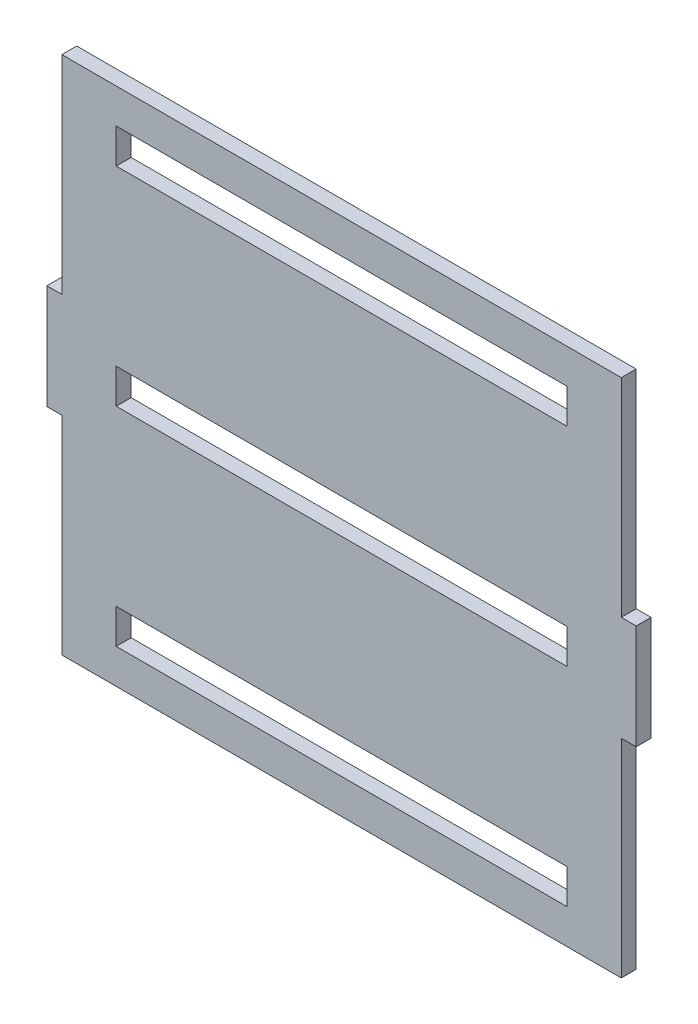
ISO-10303-21;
HEADER;
FILE_DESCRIPTION(('STEP AP214'),'2;1');
FILE_NAME('part.step','',(''),(''),'','','');
FILE_SCHEMA(('AUTOMOTIVE_DESIGN { 1 0 10303 214 1 1 1 1 }'));
ENDSEC;
DATA;
#1=APPLICATION_CONTEXT('core data for automotive mechanical design processes');
#2=APPLICATION_PROTOCOL_DEFINITION('international standard','automotive_design',2000,#1);
#3=PRODUCT_CONTEXT('',#1,'mechanical');
#4=PRODUCT('Part','Part','',(#3));
#5=PRODUCT_RELATED_PRODUCT_CATEGORY('part','',(#4));
#6=PRODUCT_DEFINITION_FORMATION('','',#4);
#7=PRODUCT_DEFINITION_CONTEXT('part definition',#1,'design');
#8=PRODUCT_DEFINITION('design','',#6,#7);
#9=PRODUCT_DEFINITION_SHAPE('','',#8);
#10=(LENGTH_UNIT() NAMED_UNIT(*) SI_UNIT(.MILLI.,.METRE.));
#11=(NAMED_UNIT(*) PLANE_ANGLE_UNIT() SI_UNIT($,.RADIAN.));
#12=(NAMED_UNIT(*) SI_UNIT($,.STERADIAN.) SOLID_ANGLE_UNIT());
#13=UNCERTAINTY_MEASURE_WITH_UNIT(LENGTH_MEASURE(1.E-05),#10,'distance_accuracy_value','');
#14=(GEOMETRIC_REPRESENTATION_CONTEXT(3) GLOBAL_UNCERTAINTY_ASSIGNED_CONTEXT((#13)) GLOBAL_UNIT_ASSIGNED_CONTEXT((#10,
#11,#12)) REPRESENTATION_CONTEXT('',''));
#15=CARTESIAN_POINT('',(0.,0.,0.));
#16=DIRECTION('',(0.,0.,1.));
#17=DIRECTION('',(1.,0.,0.));
#18=AXIS2_PLACEMENT_3D('',#15,#16,#17);
#19=CARTESIAN_POINT('',(0.,0.,4.3));
#20=DIRECTION('',(0.,0.,1.));
#21=DIRECTION('',(1.,0.,0.));
#22=AXIS2_PLACEMENT_3D('',#19,#20,#21);
#23=PLANE('',#22);
#24=DIRECTION('',(-1.,0.,0.));
#25=VECTOR('',#24,1.);
#26=CARTESIAN_POINT('',(-80.7,75.,4.3));
#27=LINE('',#26,#25);
#28=CARTESIAN_POINT('',(80.7,75.,4.3));
#29=VERTEX_POINT('',#28);
#30=CARTESIAN_POINT('',(-80.7,75.,4.3));
#31=VERTEX_POINT('',#30);
#32=EDGE_CURVE('E295',#29,#31,#27,.T.);
#33=ORIENTED_EDGE('',*,*,#32,.T.);
#34=DIRECTION('',(0.,-1.,0.));
#35=VECTOR('',#34,1.);
#36=CARTESIAN_POINT('',(-80.7,15.1,4.3));
#37=LINE('',#36,#35);
#38=CARTESIAN_POINT('',(-80.7,15.1,4.3));
#39=VERTEX_POINT('',#38);
#40=EDGE_CURVE('E298',#31,#39,#37,.T.);
#41=ORIENTED_EDGE('',*,*,#40,.T.);
#42=DIRECTION('',(-1.,0.,0.));
#43=VECTOR('',#42,1.);
#44=CARTESIAN_POINT('',(-80.7,15.1,4.3));
#45=LINE('',#44,#43);
#46=CARTESIAN_POINT('',(-85.,15.1,4.3));
#47=VERTEX_POINT('',#46);
#48=EDGE_CURVE('E301',#39,#47,#45,.T.);
#49=ORIENTED_EDGE('',*,*,#48,.T.);
#50=DIRECTION('',(0.,-1.,0.));
#51=VECTOR('',#50,1.);
#52=CARTESIAN_POINT('',(-85.,15.1,4.3));
#53=LINE('',#52,#51);
#54=CARTESIAN_POINT('',(-85.,-15.1,4.3));
#55=VERTEX_POINT('',#54);
#56=EDGE_CURVE('E303',#47,#55,#53,.T.);
#57=ORIENTED_EDGE('',*,*,#56,.T.);
#58=DIRECTION('',(1.,0.,0.));
#59=VECTOR('',#58,1.);
#60=CARTESIAN_POINT('',(-80.7,-15.1,4.3));
#61=LINE('',#60,#59);
#62=CARTESIAN_POINT('',(-80.7,-15.1,4.3));
#63=VERTEX_POINT('',#62);
#64=EDGE_CURVE('E305',#55,#63,#61,.T.);
#65=ORIENTED_EDGE('',*,*,#64,.T.);
#66=DIRECTION('',(0.,-1.,0.));
#67=VECTOR('',#66,1.);
#68=CARTESIAN_POINT('',(-80.7,-75.,4.3));
#69=LINE('',#68,#67);
#70=CARTESIAN_POINT('',(-80.7,-75.,4.3));
#71=VERTEX_POINT('',#70);
#72=EDGE_CURVE('E307',#63,#71,#69,.T.);
#73=ORIENTED_EDGE('',*,*,#72,.T.);
#74=DIRECTION('',(1.,0.,0.));
#75=VECTOR('',#74,1.);
#76=CARTESIAN_POINT('',(-80.7,-75.,4.3));
#77=LINE('',#76,#75);
#78=CARTESIAN_POINT('',(80.7,-75.,4.3));
#79=VERTEX_POINT('',#78);
#80=EDGE_CURVE('E309',#71,#79,#77,.T.);
#81=ORIENTED_EDGE('',*,*,#80,.T.);
#82=DIRECTION('',(0.,1.,0.));
#83=VECTOR('',#82,1.);
#84=CARTESIAN_POINT('',(80.7,-75.,4.3));
#85=LINE('',#84,#83);
#86=CARTESIAN_POINT('',(80.7,-15.1,4.3));
#87=VERTEX_POINT('',#86);
#88=EDGE_CURVE('E311',#79,#87,#85,.T.);
#89=ORIENTED_EDGE('',*,*,#88,.T.);
#90=DIRECTION('',(1.,0.,0.));
#91=VECTOR('',#90,1.);
#92=CARTESIAN_POINT('',(80.7,-15.1,4.3));
#93=LINE('',#92,#91);
#94=CARTESIAN_POINT('',(85.,-15.1,4.3));
#95=VERTEX_POINT('',#94);
#96=EDGE_CURVE('E313',#87,#95,#93,.T.);
#97=ORIENTED_EDGE('',*,*,#96,.T.);
#98=DIRECTION('',(0.,1.,0.));
#99=VECTOR('',#98,1.);
#100=CARTESIAN_POINT('',(85.,15.1,4.3));
#101=LINE('',#100,#99);
#102=CARTESIAN_POINT('',(85.,15.1,4.3));
#103=VERTEX_POINT('',#102);
#104=EDGE_CURVE('E315',#95,#103,#101,.T.);
#105=ORIENTED_EDGE('',*,*,#104,.T.);
#106=DIRECTION('',(-1.,0.,0.));
#107=VECTOR('',#106,1.);
#108=CARTESIAN_POINT('',(80.7,15.1,4.3));
#109=LINE('',#108,#107);
#110=CARTESIAN_POINT('',(80.7,15.1,4.3));
#111=VERTEX_POINT('',#110);
#112=EDGE_CURVE('E317',#103,#111,#109,.T.);
#113=ORIENTED_EDGE('',*,*,#112,.T.);
#114=DIRECTION('',(0.,1.,0.));
#115=VECTOR('',#114,1.);
#116=CARTESIAN_POINT('',(80.7,15.1,4.3));
#117=LINE('',#116,#115);
#118=EDGE_CURVE('E319',#111,#29,#117,.T.);
#119=ORIENTED_EDGE('',*,*,#118,.T.);
#120=EDGE_LOOP('',(#33,#41,#49,#57,#65,#73,#81,#89,#97,#105,#113,#119));
#121=FACE_BOUND('',#120,.T.);
#122=DIRECTION('',(1.,0.,0.));
#123=VECTOR('',#122,1.);
#124=CARTESIAN_POINT('',(-65.,55.,4.3));
#125=LINE('',#124,#123);
#126=CARTESIAN_POINT('',(-65.,55.,4.3));
#127=VERTEX_POINT('',#126);
#128=CARTESIAN_POINT('',(65.,55.,4.3));
#129=VERTEX_POINT('',#128);
#130=EDGE_CURVE('E266',#127,#129,#125,.T.);
#131=ORIENTED_EDGE('',*,*,#130,.F.);
#132=DIRECTION('',(0.,-1.,0.));
#133=VECTOR('',#132,1.);
#134=CARTESIAN_POINT('',(-65.,65.,4.3));
#135=LINE('',#134,#133);
#136=CARTESIAN_POINT('',(-65.,65.,4.3));
#137=VERTEX_POINT('',#136);
#138=EDGE_CURVE('E264',#137,#127,#135,.T.);
#139=ORIENTED_EDGE('',*,*,#138,.F.);
#140=DIRECTION('',(-1.,0.,0.));
#141=VECTOR('',#140,1.);
#142=CARTESIAN_POINT('',(-65.,65.,4.3));
#143=LINE('',#142,#141);
#144=CARTESIAN_POINT('',(65.,65.,4.3));
#145=VERTEX_POINT('',#144);
#146=EDGE_CURVE('E272',#145,#137,#143,.T.);
#147=ORIENTED_EDGE('',*,*,#146,.F.);
#148=DIRECTION('',(0.,1.,0.));
#149=VECTOR('',#148,1.);
#150=CARTESIAN_POINT('',(65.,65.,4.3));
#151=LINE('',#150,#149);
#152=EDGE_CURVE('E269',#129,#145,#151,.T.);
#153=ORIENTED_EDGE('',*,*,#152,.F.);
#154=EDGE_LOOP('',(#131,#139,#147,#153));
#155=FACE_BOUND('',#154,.T.);
#156=DIRECTION('',(1.,0.,0.));
#157=VECTOR('',#156,1.);
#158=CARTESIAN_POINT('',(-65.,-5.,4.3));
#159=LINE('',#158,#157);
#160=CARTESIAN_POINT('',(-65.,-5.,4.3));
#161=VERTEX_POINT('',#160);
#162=CARTESIAN_POINT('',(65.,-4.99999999999999,4.3));
#163=VERTEX_POINT('',#162);
#164=EDGE_CURVE('E235',#161,#163,#159,.T.);
#165=ORIENTED_EDGE('',*,*,#164,.F.);
#166=DIRECTION('',(0.,-1.,0.));
#167=VECTOR('',#166,1.);
#168=CARTESIAN_POINT('',(-65.,-5.,4.3));
#169=LINE('',#168,#167);
#170=CARTESIAN_POINT('',(-65.,5.,4.3));
#171=VERTEX_POINT('',#170);
#172=EDGE_CURVE('E233',#171,#161,#169,.T.);
#173=ORIENTED_EDGE('',*,*,#172,.F.);
#174=DIRECTION('',(-1.,0.,0.));
#175=VECTOR('',#174,1.);
#176=CARTESIAN_POINT('',(-65.,5.,4.3));
#177=LINE('',#176,#175);
#178=CARTESIAN_POINT('',(65.,5.00000000000001,4.3));
#179=VERTEX_POINT('',#178);
#180=EDGE_CURVE('E241',#179,#171,#177,.T.);
#181=ORIENTED_EDGE('',*,*,#180,.F.);
#182=DIRECTION('',(0.,1.,0.));
#183=VECTOR('',#182,1.);
#184=CARTESIAN_POINT('',(65.,-4.99999999999999,4.3));
#185=LINE('',#184,#183);
#186=EDGE_CURVE('E238',#163,#179,#185,.T.);
#187=ORIENTED_EDGE('',*,*,#186,.F.);
#188=EDGE_LOOP('',(#165,#173,#181,#187));
#189=FACE_BOUND('',#188,.T.);
#190=DIRECTION('',(1.,0.,0.));
#191=VECTOR('',#190,1.);
#192=CARTESIAN_POINT('',(-65.,-65.,4.3));
#193=LINE('',#192,#191);
#194=CARTESIAN_POINT('',(-65.,-65.,4.3));
#195=VERTEX_POINT('',#194);
#196=CARTESIAN_POINT('',(65.,-65.,4.3));
#197=VERTEX_POINT('',#196);
#198=EDGE_CURVE('E205',#195,#197,#193,.T.);
#199=ORIENTED_EDGE('',*,*,#198,.F.);
#200=DIRECTION('',(0.,-1.,0.));
#201=VECTOR('',#200,1.);
#202=CARTESIAN_POINT('',(-65.,-65.,4.3));
#203=LINE('',#202,#201);
#204=CARTESIAN_POINT('',(-65.,-55.,4.3));
#205=VERTEX_POINT('',#204);
#206=EDGE_CURVE('E197',#205,#195,#203,.T.);
#207=ORIENTED_EDGE('',*,*,#206,.F.);
#208=DIRECTION('',(-1.,0.,0.));
#209=VECTOR('',#208,1.);
#210=CARTESIAN_POINT('',(-65.,-55.,4.3));
#211=LINE('',#210,#209);
#212=CARTESIAN_POINT('',(65.,-55.,4.3));
#213=VERTEX_POINT('',#212);
#214=EDGE_CURVE('E219',#213,#205,#211,.T.);
#215=ORIENTED_EDGE('',*,*,#214,.F.);
#216=DIRECTION('',(0.,1.,0.));
#217=VECTOR('',#216,1.);
#218=CARTESIAN_POINT('',(65.,-65.,4.3));
#219=LINE('',#218,#217);
#220=EDGE_CURVE('E217',#197,#213,#219,.T.);
#221=ORIENTED_EDGE('',*,*,#220,.F.);
#222=EDGE_LOOP('',(#199,#207,#215,#221));
#223=FACE_BOUND('',#222,.T.);
#224=ADVANCED_FACE('F36',(#121,#155,#189,#223),#23,.T.);
#225=CARTESIAN_POINT('',(0.,0.,0.));
#226=DIRECTION('',(0.,0.,1.));
#227=DIRECTION('',(1.,0.,0.));
#228=AXIS2_PLACEMENT_3D('',#225,#226,#227);
#229=PLANE('',#228);
#230=DIRECTION('',(0.,-1.,0.));
#231=VECTOR('',#230,1.);
#232=CARTESIAN_POINT('',(-65.,-5.,0.));
#233=LINE('',#232,#231);
#234=CARTESIAN_POINT('',(-65.,5.,0.));
#235=VERTEX_POINT('',#234);
#236=CARTESIAN_POINT('',(-65.,-5.,0.));
#237=VERTEX_POINT('',#236);
#238=EDGE_CURVE('E213',#235,#237,#233,.T.);
#239=ORIENTED_EDGE('',*,*,#238,.T.);
#240=DIRECTION('',(1.,0.,0.));
#241=VECTOR('',#240,1.);
#242=CARTESIAN_POINT('',(-65.,-5.,0.));
#243=LINE('',#242,#241);
#244=CARTESIAN_POINT('',(65.,-4.99999999999999,0.));
#245=VERTEX_POINT('',#244);
#246=EDGE_CURVE('E246',#237,#245,#243,.T.);
#247=ORIENTED_EDGE('',*,*,#246,.T.);
#248=DIRECTION('',(0.,1.,0.));
#249=VECTOR('',#248,1.);
#250=CARTESIAN_POINT('',(65.,-4.99999999999999,0.));
#251=LINE('',#250,#249);
#252=CARTESIAN_POINT('',(65.,5.00000000000001,0.));
#253=VERTEX_POINT('',#252);
#254=EDGE_CURVE('E249',#245,#253,#251,.T.);
#255=ORIENTED_EDGE('',*,*,#254,.T.);
#256=DIRECTION('',(-1.,0.,0.));
#257=VECTOR('',#256,1.);
#258=CARTESIAN_POINT('',(-65.,5.,0.));
#259=LINE('',#258,#257);
#260=EDGE_CURVE('E236',#253,#235,#259,.T.);
#261=ORIENTED_EDGE('',*,*,#260,.T.);
#262=EDGE_LOOP('',(#239,#247,#255,#261));
#263=FACE_BOUND('',#262,.T.);
#264=DIRECTION('',(-1.,0.,0.));
#265=VECTOR('',#264,1.);
#266=CARTESIAN_POINT('',(-80.7,75.,0.));
#267=LINE('',#266,#265);
#268=CARTESIAN_POINT('',(80.7,75.,0.));
#269=VERTEX_POINT('',#268);
#270=CARTESIAN_POINT('',(-80.7,75.,0.));
#271=VERTEX_POINT('',#270);
#272=EDGE_CURVE('E294',#269,#271,#267,.T.);
#273=ORIENTED_EDGE('',*,*,#272,.F.);
#274=DIRECTION('',(0.,1.,0.));
#275=VECTOR('',#274,1.);
#276=CARTESIAN_POINT('',(80.7,15.1,0.));
#277=LINE('',#276,#275);
#278=CARTESIAN_POINT('',(80.7,15.1,0.));
#279=VERTEX_POINT('',#278);
#280=EDGE_CURVE('E299',#279,#269,#277,.T.);
#281=ORIENTED_EDGE('',*,*,#280,.F.);
#282=DIRECTION('',(-1.,0.,0.));
#283=VECTOR('',#282,1.);
#284=CARTESIAN_POINT('',(80.7,15.1,0.));
#285=LINE('',#284,#283);
#286=CARTESIAN_POINT('',(85.,15.1,0.));
#287=VERTEX_POINT('',#286);
#288=EDGE_CURVE('E342',#287,#279,#285,.T.);
#289=ORIENTED_EDGE('',*,*,#288,.F.);
#290=DIRECTION('',(0.,1.,0.));
#291=VECTOR('',#290,1.);
#292=CARTESIAN_POINT('',(85.,15.1,0.));
#293=LINE('',#292,#291);
#294=CARTESIAN_POINT('',(85.,-15.1,0.));
#295=VERTEX_POINT('',#294);
#296=EDGE_CURVE('E340',#295,#287,#293,.T.);
#297=ORIENTED_EDGE('',*,*,#296,.F.);
#298=DIRECTION('',(1.,0.,0.));
#299=VECTOR('',#298,1.);
#300=CARTESIAN_POINT('',(80.7,-15.1,0.));
#301=LINE('',#300,#299);
#302=CARTESIAN_POINT('',(80.7,-15.1,0.));
#303=VERTEX_POINT('',#302);
#304=EDGE_CURVE('E338',#303,#295,#301,.T.);
#305=ORIENTED_EDGE('',*,*,#304,.F.);
#306=DIRECTION('',(0.,1.,0.));
#307=VECTOR('',#306,1.);
#308=CARTESIAN_POINT('',(80.7,-75.,0.));
#309=LINE('',#308,#307);
#310=CARTESIAN_POINT('',(80.7,-75.,0.));
#311=VERTEX_POINT('',#310);
#312=EDGE_CURVE('E336',#311,#303,#309,.T.);
#313=ORIENTED_EDGE('',*,*,#312,.F.);
#314=DIRECTION('',(1.,0.,0.));
#315=VECTOR('',#314,1.);
#316=CARTESIAN_POINT('',(-80.7,-75.,0.));
#317=LINE('',#316,#315);
#318=CARTESIAN_POINT('',(-80.7,-75.,0.));
#319=VERTEX_POINT('',#318);
#320=EDGE_CURVE('E334',#319,#311,#317,.T.);
#321=ORIENTED_EDGE('',*,*,#320,.F.);
#322=DIRECTION('',(0.,-1.,0.));
#323=VECTOR('',#322,1.);
#324=CARTESIAN_POINT('',(-80.7,-75.,0.));
#325=LINE('',#324,#323);
#326=CARTESIAN_POINT('',(-80.7,-15.1,0.));
#327=VERTEX_POINT('',#326);
#328=EDGE_CURVE('E332',#327,#319,#325,.T.);
#329=ORIENTED_EDGE('',*,*,#328,.F.);
#330=DIRECTION('',(1.,0.,0.));
#331=VECTOR('',#330,1.);
#332=CARTESIAN_POINT('',(-80.7,-15.1,0.));
#333=LINE('',#332,#331);
#334=CARTESIAN_POINT('',(-85.,-15.1,0.));
#335=VERTEX_POINT('',#334);
#336=EDGE_CURVE('E330',#335,#327,#333,.T.);
#337=ORIENTED_EDGE('',*,*,#336,.F.);
#338=DIRECTION('',(0.,-1.,0.));
#339=VECTOR('',#338,1.);
#340=CARTESIAN_POINT('',(-85.,15.1,0.));
#341=LINE('',#340,#339);
#342=CARTESIAN_POINT('',(-85.,15.1,0.));
#343=VERTEX_POINT('',#342);
#344=EDGE_CURVE('E328',#343,#335,#341,.T.);
#345=ORIENTED_EDGE('',*,*,#344,.F.);
#346=DIRECTION('',(-1.,0.,0.));
#347=VECTOR('',#346,1.);
#348=CARTESIAN_POINT('',(-80.7,15.1,0.));
#349=LINE('',#348,#347);
#350=CARTESIAN_POINT('',(-80.7,15.1,0.));
#351=VERTEX_POINT('',#350);
#352=EDGE_CURVE('E326',#351,#343,#349,.T.);
#353=ORIENTED_EDGE('',*,*,#352,.F.);
#354=DIRECTION('',(0.,-1.,0.));
#355=VECTOR('',#354,1.);
#356=CARTESIAN_POINT('',(-80.7,15.1,0.));
#357=LINE('',#356,#355);
#358=EDGE_CURVE('E324',#271,#351,#357,.T.);
#359=ORIENTED_EDGE('',*,*,#358,.F.);
#360=EDGE_LOOP('',(#273,#281,#289,#297,#305,#313,#321,#329,#337,#345,#353,#359));
#361=FACE_BOUND('',#360,.T.);
#362=DIRECTION('',(0.,-1.,0.));
#363=VECTOR('',#362,1.);
#364=CARTESIAN_POINT('',(-65.,65.,0.));
#365=LINE('',#364,#363);
#366=CARTESIAN_POINT('',(-65.,65.,0.));
#367=VERTEX_POINT('',#366);
#368=CARTESIAN_POINT('',(-65.,55.,0.));
#369=VERTEX_POINT('',#368);
#370=EDGE_CURVE('E263',#367,#369,#365,.T.);
#371=ORIENTED_EDGE('',*,*,#370,.T.);
#372=DIRECTION('',(1.,0.,0.));
#373=VECTOR('',#372,1.);
#374=CARTESIAN_POINT('',(-65.,55.,0.));
#375=LINE('',#374,#373);
#376=CARTESIAN_POINT('',(65.,55.,0.));
#377=VERTEX_POINT('',#376);
#378=EDGE_CURVE('E277',#369,#377,#375,.T.);
#379=ORIENTED_EDGE('',*,*,#378,.T.);
#380=DIRECTION('',(0.,1.,0.));
#381=VECTOR('',#380,1.);
#382=CARTESIAN_POINT('',(65.,65.,0.));
#383=LINE('',#382,#381);
#384=CARTESIAN_POINT('',(65.,65.,0.));
#385=VERTEX_POINT('',#384);
#386=EDGE_CURVE('E280',#377,#385,#383,.T.);
#387=ORIENTED_EDGE('',*,*,#386,.T.);
#388=DIRECTION('',(-1.,0.,0.));
#389=VECTOR('',#388,1.);
#390=CARTESIAN_POINT('',(-65.,65.,0.));
#391=LINE('',#390,#389);
#392=EDGE_CURVE('E267',#385,#367,#391,.T.);
#393=ORIENTED_EDGE('',*,*,#392,.T.);
#394=EDGE_LOOP('',(#371,#379,#387,#393));
#395=FACE_BOUND('',#394,.T.);
#396=DIRECTION('',(0.,-1.,0.));
#397=VECTOR('',#396,1.);
#398=CARTESIAN_POINT('',(-65.,-65.,0.));
#399=LINE('',#398,#397);
#400=CARTESIAN_POINT('',(-65.,-55.,0.));
#401=VERTEX_POINT('',#400);
#402=CARTESIAN_POINT('',(-65.,-65.,0.));
#403=VERTEX_POINT('',#402);
#404=EDGE_CURVE('E59',#401,#403,#399,.T.);
#405=ORIENTED_EDGE('',*,*,#404,.T.);
#406=DIRECTION('',(1.,0.,0.));
#407=VECTOR('',#406,1.);
#408=CARTESIAN_POINT('',(-65.,-65.,0.));
#409=LINE('',#408,#407);
#410=CARTESIAN_POINT('',(65.,-65.,0.));
#411=VERTEX_POINT('',#410);
#412=EDGE_CURVE('E212',#403,#411,#409,.T.);
#413=ORIENTED_EDGE('',*,*,#412,.T.);
#414=DIRECTION('',(0.,1.,0.));
#415=VECTOR('',#414,1.);
#416=CARTESIAN_POINT('',(65.,-65.,0.));
#417=LINE('',#416,#415);
#418=CARTESIAN_POINT('',(65.,-55.,0.));
#419=VERTEX_POINT('',#418);
#420=EDGE_CURVE('E225',#411,#419,#417,.T.);
#421=ORIENTED_EDGE('',*,*,#420,.T.);
#422=DIRECTION('',(-1.,0.,0.));
#423=VECTOR('',#422,1.);
#424=CARTESIAN_POINT('',(-65.,-55.,0.));
#425=LINE('',#424,#423);
#426=EDGE_CURVE('E206',#419,#401,#425,.T.);
#427=ORIENTED_EDGE('',*,*,#426,.T.);
#428=EDGE_LOOP('',(#405,#413,#421,#427));
#429=FACE_BOUND('',#428,.T.);
#430=ADVANCED_FACE('F384',(#263,#361,#395,#429),#229,.F.);
#431=CARTESIAN_POINT('',(-80.7,75.,4.3));
#432=DIRECTION('',(0.,-1.,0.));
#433=DIRECTION('',(0.,0.,-1.));
#434=AXIS2_PLACEMENT_3D('',#431,#432,#433);
#435=PLANE('',#434);
#436=ORIENTED_EDGE('',*,*,#272,.T.);
#437=DIRECTION('',(0.,0.,-1.));
#438=VECTOR('',#437,1.);
#439=CARTESIAN_POINT('',(-80.7,75.,4.3));
#440=LINE('',#439,#438);
#441=EDGE_CURVE('E11',#31,#271,#440,.T.);
#442=ORIENTED_EDGE('',*,*,#441,.F.);
#443=ORIENTED_EDGE('',*,*,#32,.F.);
#444=DIRECTION('',(0.,0.,-1.));
#445=VECTOR('',#444,1.);
#446=CARTESIAN_POINT('',(80.7,75.,4.3));
#447=LINE('',#446,#445);
#448=EDGE_CURVE('E321',#29,#269,#447,.T.);
#449=ORIENTED_EDGE('',*,*,#448,.T.);
#450=EDGE_LOOP('',(#436,#442,#443,#449));
#451=FACE_BOUND('',#450,.T.);
#452=ADVANCED_FACE('F38',(#451),#435,.F.);
#453=CARTESIAN_POINT('',(-80.7,15.1,4.3));
#454=DIRECTION('',(1.,0.,0.));
#455=DIRECTION('',(0.,0.,-1.));
#456=AXIS2_PLACEMENT_3D('',#453,#454,#455);
#457=PLANE('',#456);
#458=ORIENTED_EDGE('',*,*,#358,.T.);
#459=DIRECTION('',(0.,0.,-1.));
#460=VECTOR('',#459,1.);
#461=CARTESIAN_POINT('',(-80.7,15.1,4.3));
#462=LINE('',#461,#460);
#463=EDGE_CURVE('E44',#39,#351,#462,.T.);
#464=ORIENTED_EDGE('',*,*,#463,.F.);
#465=ORIENTED_EDGE('',*,*,#40,.F.);
#466=ORIENTED_EDGE('',*,*,#441,.T.);
#467=EDGE_LOOP('',(#458,#464,#465,#466));
#468=FACE_BOUND('',#467,.T.);
#469=ADVANCED_FACE('F402',(#468),#457,.F.);
#470=CARTESIAN_POINT('',(-80.7,15.1,4.3));
#471=DIRECTION('',(0.,-1.,0.));
#472=DIRECTION('',(0.,0.,-1.));
#473=AXIS2_PLACEMENT_3D('',#470,#471,#472);
#474=PLANE('',#473);
#475=ORIENTED_EDGE('',*,*,#352,.T.);
#476=DIRECTION('',(0.,0.,-1.));
#477=VECTOR('',#476,1.);
#478=CARTESIAN_POINT('',(-85.,15.1,4.3));
#479=LINE('',#478,#477);
#480=EDGE_CURVE('E371',#47,#343,#479,.T.);
#481=ORIENTED_EDGE('',*,*,#480,.F.);
#482=ORIENTED_EDGE('',*,*,#48,.F.);
#483=ORIENTED_EDGE('',*,*,#463,.T.);
#484=EDGE_LOOP('',(#475,#481,#482,#483));
#485=FACE_BOUND('',#484,.T.);
#486=ADVANCED_FACE('F378',(#485),#474,.F.);
#487=CARTESIAN_POINT('',(-85.,15.1,4.3));
#488=DIRECTION('',(1.,0.,0.));
#489=DIRECTION('',(0.,0.,-1.));
#490=AXIS2_PLACEMENT_3D('',#487,#488,#489);
#491=PLANE('',#490);
#492=ORIENTED_EDGE('',*,*,#344,.T.);
#493=DIRECTION('',(0.,0.,-1.));
#494=VECTOR('',#493,1.);
#495=CARTESIAN_POINT('',(-85.,-15.1,4.3));
#496=LINE('',#495,#494);
#497=EDGE_CURVE('E368',#55,#335,#496,.T.);
#498=ORIENTED_EDGE('',*,*,#497,.F.);
#499=ORIENTED_EDGE('',*,*,#56,.F.);
#500=ORIENTED_EDGE('',*,*,#480,.T.);
#501=EDGE_LOOP('',(#492,#498,#499,#500));
#502=FACE_BOUND('',#501,.T.);
#503=ADVANCED_FACE('F390',(#502),#491,.F.);
#504=CARTESIAN_POINT('',(-80.7,-15.1,4.3));
#505=DIRECTION('',(0.,1.,0.));
#506=DIRECTION('',(0.,0.,1.));
#507=AXIS2_PLACEMENT_3D('',#504,#505,#506);
#508=PLANE('',#507);
#509=ORIENTED_EDGE('',*,*,#336,.T.);
#510=DIRECTION('',(0.,0.,-1.));
#511=VECTOR('',#510,1.);
#512=CARTESIAN_POINT('',(-80.7,-15.1,4.3));
#513=LINE('',#512,#511);
#514=EDGE_CURVE('E365',#63,#327,#513,.T.);
#515=ORIENTED_EDGE('',*,*,#514,.F.);
#516=ORIENTED_EDGE('',*,*,#64,.F.);
#517=ORIENTED_EDGE('',*,*,#497,.T.);
#518=EDGE_LOOP('',(#509,#515,#516,#517));
#519=FACE_BOUND('',#518,.T.);
#520=ADVANCED_FACE('F394',(#519),#508,.F.);
#521=CARTESIAN_POINT('',(-80.7,-75.,4.3));
#522=DIRECTION('',(1.,0.,0.));
#523=DIRECTION('',(0.,0.,-1.));
#524=AXIS2_PLACEMENT_3D('',#521,#522,#523);
#525=PLANE('',#524);
#526=ORIENTED_EDGE('',*,*,#328,.T.);
#527=DIRECTION('',(0.,0.,-1.));
#528=VECTOR('',#527,1.);
#529=CARTESIAN_POINT('',(-80.7,-75.,4.3));
#530=LINE('',#529,#528);
#531=EDGE_CURVE('E362',#71,#319,#530,.T.);
#532=ORIENTED_EDGE('',*,*,#531,.F.);
#533=ORIENTED_EDGE('',*,*,#72,.F.);
#534=ORIENTED_EDGE('',*,*,#514,.T.);
#535=EDGE_LOOP('',(#526,#532,#533,#534));
#536=FACE_BOUND('',#535,.T.);
#537=ADVANCED_FACE('F435',(#536),#525,.F.);
#538=CARTESIAN_POINT('',(-80.7,-75.,4.3));
#539=DIRECTION('',(0.,1.,0.));
#540=DIRECTION('',(0.,0.,1.));
#541=AXIS2_PLACEMENT_3D('',#538,#539,#540);
#542=PLANE('',#541);
#543=ORIENTED_EDGE('',*,*,#320,.T.);
#544=DIRECTION('',(0.,0.,-1.));
#545=VECTOR('',#544,1.);
#546=CARTESIAN_POINT('',(80.7,-75.,4.3));
#547=LINE('',#546,#545);
#548=EDGE_CURVE('E359',#79,#311,#547,.T.);
#549=ORIENTED_EDGE('',*,*,#548,.F.);
#550=ORIENTED_EDGE('',*,*,#80,.F.);
#551=ORIENTED_EDGE('',*,*,#531,.T.);
#552=EDGE_LOOP('',(#543,#549,#550,#551));
#553=FACE_BOUND('',#552,.T.);
#554=ADVANCED_FACE('F433',(#553),#542,.F.);
#555=CARTESIAN_POINT('',(80.7,-75.,4.3));
#556=DIRECTION('',(-1.,0.,0.));
#557=DIRECTION('',(0.,-1.,0.));
#558=AXIS2_PLACEMENT_3D('',#555,#556,#557);
#559=PLANE('',#558);
#560=ORIENTED_EDGE('',*,*,#312,.T.);
#561=DIRECTION('',(0.,0.,-1.));
#562=VECTOR('',#561,1.);
#563=CARTESIAN_POINT('',(80.7,-15.1,4.3));
#564=LINE('',#563,#562);
#565=EDGE_CURVE('E356',#87,#303,#564,.T.);
#566=ORIENTED_EDGE('',*,*,#565,.F.);
#567=ORIENTED_EDGE('',*,*,#88,.F.);
#568=ORIENTED_EDGE('',*,*,#548,.T.);
#569=EDGE_LOOP('',(#560,#566,#567,#568));
#570=FACE_BOUND('',#569,.T.);
#571=ADVANCED_FACE('F429',(#570),#559,.F.);
#572=CARTESIAN_POINT('',(80.7,-15.1,4.3));
#573=DIRECTION('',(0.,1.,0.));
#574=DIRECTION('',(0.,0.,1.));
#575=AXIS2_PLACEMENT_3D('',#572,#573,#574);
#576=PLANE('',#575);
#577=ORIENTED_EDGE('',*,*,#304,.T.);
#578=DIRECTION('',(0.,0.,-1.));
#579=VECTOR('',#578,1.);
#580=CARTESIAN_POINT('',(85.,-15.1,4.3));
#581=LINE('',#580,#579);
#582=EDGE_CURVE('E353',#95,#295,#581,.T.);
#583=ORIENTED_EDGE('',*,*,#582,.F.);
#584=ORIENTED_EDGE('',*,*,#96,.F.);
#585=ORIENTED_EDGE('',*,*,#565,.T.);
#586=EDGE_LOOP('',(#577,#583,#584,#585));
#587=FACE_BOUND('',#586,.T.);
#588=ADVANCED_FACE('F424',(#587),#576,.F.);
#589=CARTESIAN_POINT('',(85.,15.1,4.3));
#590=DIRECTION('',(-1.,0.,0.));
#591=DIRECTION('',(0.,0.,1.));
#592=AXIS2_PLACEMENT_3D('',#589,#590,#591);
#593=PLANE('',#592);
#594=ORIENTED_EDGE('',*,*,#296,.T.);
#595=DIRECTION('',(0.,0.,-1.));
#596=VECTOR('',#595,1.);
#597=CARTESIAN_POINT('',(85.,15.1,4.3));
#598=LINE('',#597,#596);
#599=EDGE_CURVE('E350',#103,#287,#598,.T.);
#600=ORIENTED_EDGE('',*,*,#599,.F.);
#601=ORIENTED_EDGE('',*,*,#104,.F.);
#602=ORIENTED_EDGE('',*,*,#582,.T.);
#603=EDGE_LOOP('',(#594,#600,#601,#602));
#604=FACE_BOUND('',#603,.T.);
#605=ADVANCED_FACE('F418',(#604),#593,.F.);
#606=CARTESIAN_POINT('',(80.7,15.1,4.3));
#607=DIRECTION('',(0.,-1.,0.));
#608=DIRECTION('',(0.,0.,-1.));
#609=AXIS2_PLACEMENT_3D('',#606,#607,#608);
#610=PLANE('',#609);
#611=ORIENTED_EDGE('',*,*,#288,.T.);
#612=DIRECTION('',(0.,0.,-1.));
#613=VECTOR('',#612,1.);
#614=CARTESIAN_POINT('',(80.7,15.1,4.3));
#615=LINE('',#614,#613);
#616=EDGE_CURVE('E347',#111,#279,#615,.T.);
#617=ORIENTED_EDGE('',*,*,#616,.F.);
#618=ORIENTED_EDGE('',*,*,#112,.F.);
#619=ORIENTED_EDGE('',*,*,#599,.T.);
#620=EDGE_LOOP('',(#611,#617,#618,#619));
#621=FACE_BOUND('',#620,.T.);
#622=ADVANCED_FACE('F414',(#621),#610,.F.);
#623=CARTESIAN_POINT('',(80.7,15.1,4.3));
#624=DIRECTION('',(-1.,0.,0.));
#625=DIRECTION('',(0.,-1.,0.));
#626=AXIS2_PLACEMENT_3D('',#623,#624,#625);
#627=PLANE('',#626);
#628=ORIENTED_EDGE('',*,*,#280,.T.);
#629=ORIENTED_EDGE('',*,*,#448,.F.);
#630=ORIENTED_EDGE('',*,*,#118,.F.);
#631=ORIENTED_EDGE('',*,*,#616,.T.);
#632=EDGE_LOOP('',(#628,#629,#630,#631));
#633=FACE_BOUND('',#632,.T.);
#634=ADVANCED_FACE('F409',(#633),#627,.F.);
#635=CARTESIAN_POINT('',(-65.,65.,4.3));
#636=DIRECTION('',(1.,0.,0.));
#637=DIRECTION('',(0.,0.,-1.));
#638=AXIS2_PLACEMENT_3D('',#635,#636,#637);
#639=PLANE('',#638);
#640=ORIENTED_EDGE('',*,*,#370,.F.);
#641=DIRECTION('',(0.,0.,-1.));
#642=VECTOR('',#641,1.);
#643=CARTESIAN_POINT('',(-65.,65.,4.3));
#644=LINE('',#643,#642);
#645=EDGE_CURVE('E274',#137,#367,#644,.T.);
#646=ORIENTED_EDGE('',*,*,#645,.F.);
#647=ORIENTED_EDGE('',*,*,#138,.T.);
#648=DIRECTION('',(0.,0.,-1.));
#649=VECTOR('',#648,1.);
#650=CARTESIAN_POINT('',(-65.,55.,4.3));
#651=LINE('',#650,#649);
#652=EDGE_CURVE('E291',#127,#369,#651,.T.);
#653=ORIENTED_EDGE('',*,*,#652,.T.);
#654=EDGE_LOOP('',(#640,#646,#647,#653));
#655=FACE_BOUND('',#654,.T.);
#656=ADVANCED_FACE('F452',(#655),#639,.T.);
#657=CARTESIAN_POINT('',(-65.,55.,4.3));
#658=DIRECTION('',(0.,1.,0.));
#659=DIRECTION('',(0.,0.,1.));
#660=AXIS2_PLACEMENT_3D('',#657,#658,#659);
#661=PLANE('',#660);
#662=ORIENTED_EDGE('',*,*,#378,.F.);
#663=ORIENTED_EDGE('',*,*,#652,.F.);
#664=ORIENTED_EDGE('',*,*,#130,.T.);
#665=DIRECTION('',(0.,0.,-1.));
#666=VECTOR('',#665,1.);
#667=CARTESIAN_POINT('',(65.,55.,4.3));
#668=LINE('',#667,#666);
#669=EDGE_CURVE('E289',#129,#377,#668,.T.);
#670=ORIENTED_EDGE('',*,*,#669,.T.);
#671=EDGE_LOOP('',(#662,#663,#664,#670));
#672=FACE_BOUND('',#671,.T.);
#673=ADVANCED_FACE('F490',(#672),#661,.T.);
#674=CARTESIAN_POINT('',(65.,65.,4.3));
#675=DIRECTION('',(-1.,0.,0.));
#676=DIRECTION('',(0.,0.,1.));
#677=AXIS2_PLACEMENT_3D('',#674,#675,#676);
#678=PLANE('',#677);
#679=ORIENTED_EDGE('',*,*,#386,.F.);
#680=ORIENTED_EDGE('',*,*,#669,.F.);
#681=ORIENTED_EDGE('',*,*,#152,.T.);
#682=DIRECTION('',(0.,0.,-1.));
#683=VECTOR('',#682,1.);
#684=CARTESIAN_POINT('',(65.,65.,4.3));
#685=LINE('',#684,#683);
#686=EDGE_CURVE('E287',#145,#385,#685,.T.);
#687=ORIENTED_EDGE('',*,*,#686,.T.);
#688=EDGE_LOOP('',(#679,#680,#681,#687));
#689=FACE_BOUND('',#688,.T.);
#690=ADVANCED_FACE('F497',(#689),#678,.T.);
#691=CARTESIAN_POINT('',(-65.,65.,4.3));
#692=DIRECTION('',(0.,-1.,0.));
#693=DIRECTION('',(0.,0.,-1.));
#694=AXIS2_PLACEMENT_3D('',#691,#692,#693);
#695=PLANE('',#694);
#696=ORIENTED_EDGE('',*,*,#392,.F.);
#697=ORIENTED_EDGE('',*,*,#686,.F.);
#698=ORIENTED_EDGE('',*,*,#146,.T.);
#699=ORIENTED_EDGE('',*,*,#645,.T.);
#700=EDGE_LOOP('',(#696,#697,#698,#699));
#701=FACE_BOUND('',#700,.T.);
#702=ADVANCED_FACE('F504',(#701),#695,.T.);
#703=CARTESIAN_POINT('',(-65.,-5.,4.3));
#704=DIRECTION('',(1.,0.,0.));
#705=DIRECTION('',(0.,0.,-1.));
#706=AXIS2_PLACEMENT_3D('',#703,#704,#705);
#707=PLANE('',#706);
#708=ORIENTED_EDGE('',*,*,#238,.F.);
#709=DIRECTION('',(0.,0.,-1.));
#710=VECTOR('',#709,1.);
#711=CARTESIAN_POINT('',(-65.,5.,4.3));
#712=LINE('',#711,#710);
#713=EDGE_CURVE('E243',#171,#235,#712,.T.);
#714=ORIENTED_EDGE('',*,*,#713,.F.);
#715=ORIENTED_EDGE('',*,*,#172,.T.);
#716=DIRECTION('',(0.,0.,-1.));
#717=VECTOR('',#716,1.);
#718=CARTESIAN_POINT('',(-65.,-5.,4.3));
#719=LINE('',#718,#717);
#720=EDGE_CURVE('E260',#161,#237,#719,.T.);
#721=ORIENTED_EDGE('',*,*,#720,.T.);
#722=EDGE_LOOP('',(#708,#714,#715,#721));
#723=FACE_BOUND('',#722,.T.);
#724=ADVANCED_FACE('F512',(#723),#707,.T.);
#725=CARTESIAN_POINT('',(-65.,-5.,4.3));
#726=DIRECTION('',(0.,1.,0.));
#727=DIRECTION('',(-1.,0.,0.));
#728=AXIS2_PLACEMENT_3D('',#725,#726,#727);
#729=PLANE('',#728);
#730=ORIENTED_EDGE('',*,*,#246,.F.);
#731=ORIENTED_EDGE('',*,*,#720,.F.);
#732=ORIENTED_EDGE('',*,*,#164,.T.);
#733=DIRECTION('',(0.,0.,-1.));
#734=VECTOR('',#733,1.);
#735=CARTESIAN_POINT('',(65.,-4.99999999999999,4.3));
#736=LINE('',#735,#734);
#737=EDGE_CURVE('E258',#163,#245,#736,.T.);
#738=ORIENTED_EDGE('',*,*,#737,.T.);
#739=EDGE_LOOP('',(#730,#731,#732,#738));
#740=FACE_BOUND('',#739,.T.);
#741=ADVANCED_FACE('F520',(#740),#729,.T.);
#742=CARTESIAN_POINT('',(65.,-4.99999999999999,4.3));
#743=DIRECTION('',(-1.,0.,0.));
#744=DIRECTION('',(0.,0.,1.));
#745=AXIS2_PLACEMENT_3D('',#742,#743,#744);
#746=PLANE('',#745);
#747=ORIENTED_EDGE('',*,*,#254,.F.);
#748=ORIENTED_EDGE('',*,*,#737,.F.);
#749=ORIENTED_EDGE('',*,*,#186,.T.);
#750=DIRECTION('',(0.,0.,-1.));
#751=VECTOR('',#750,1.);
#752=CARTESIAN_POINT('',(65.,5.00000000000001,4.3));
#753=LINE('',#752,#751);
#754=EDGE_CURVE('E256',#179,#253,#753,.T.);
#755=ORIENTED_EDGE('',*,*,#754,.T.);
#756=EDGE_LOOP('',(#747,#748,#749,#755));
#757=FACE_BOUND('',#756,.T.);
#758=ADVANCED_FACE('F528',(#757),#746,.T.);
#759=CARTESIAN_POINT('',(-65.,5.,4.3));
#760=DIRECTION('',(0.,-1.,0.));
#761=DIRECTION('',(1.,0.,0.));
#762=AXIS2_PLACEMENT_3D('',#759,#760,#761);
#763=PLANE('',#762);
#764=ORIENTED_EDGE('',*,*,#260,.F.);
#765=ORIENTED_EDGE('',*,*,#754,.F.);
#766=ORIENTED_EDGE('',*,*,#180,.T.);
#767=ORIENTED_EDGE('',*,*,#713,.T.);
#768=EDGE_LOOP('',(#764,#765,#766,#767));
#769=FACE_BOUND('',#768,.T.);
#770=ADVANCED_FACE('F536',(#769),#763,.T.);
#771=CARTESIAN_POINT('',(-65.,-65.,4.3));
#772=DIRECTION('',(1.,0.,0.));
#773=DIRECTION('',(0.,0.,-1.));
#774=AXIS2_PLACEMENT_3D('',#771,#772,#773);
#775=PLANE('',#774);
#776=ORIENTED_EDGE('',*,*,#404,.F.);
#777=DIRECTION('',(0.,0.,-1.));
#778=VECTOR('',#777,1.);
#779=CARTESIAN_POINT('',(-65.,-55.,4.3));
#780=LINE('',#779,#778);
#781=EDGE_CURVE('E201',#205,#401,#780,.T.);
#782=ORIENTED_EDGE('',*,*,#781,.F.);
#783=ORIENTED_EDGE('',*,*,#206,.T.);
#784=DIRECTION('',(0.,0.,-1.));
#785=VECTOR('',#784,1.);
#786=CARTESIAN_POINT('',(-65.,-65.,4.3));
#787=LINE('',#786,#785);
#788=EDGE_CURVE('E200',#195,#403,#787,.T.);
#789=ORIENTED_EDGE('',*,*,#788,.T.);
#790=EDGE_LOOP('',(#776,#782,#783,#789));
#791=FACE_BOUND('',#790,.T.);
#792=ADVANCED_FACE('F199',(#791),#775,.T.);
#793=CARTESIAN_POINT('',(-65.,-65.,4.3));
#794=DIRECTION('',(0.,1.,0.));
#795=DIRECTION('',(0.,0.,1.));
#796=AXIS2_PLACEMENT_3D('',#793,#794,#795);
#797=PLANE('',#796);
#798=ORIENTED_EDGE('',*,*,#412,.F.);
#799=ORIENTED_EDGE('',*,*,#788,.F.);
#800=ORIENTED_EDGE('',*,*,#198,.T.);
#801=DIRECTION('',(0.,0.,-1.));
#802=VECTOR('',#801,1.);
#803=CARTESIAN_POINT('',(65.,-65.,4.3));
#804=LINE('',#803,#802);
#805=EDGE_CURVE('E214',#197,#411,#804,.T.);
#806=ORIENTED_EDGE('',*,*,#805,.T.);
#807=EDGE_LOOP('',(#798,#799,#800,#806));
#808=FACE_BOUND('',#807,.T.);
#809=ADVANCED_FACE('F209',(#808),#797,.T.);
#810=CARTESIAN_POINT('',(65.,-65.,4.3));
#811=DIRECTION('',(-1.,0.,0.));
#812=DIRECTION('',(0.,0.,1.));
#813=AXIS2_PLACEMENT_3D('',#810,#811,#812);
#814=PLANE('',#813);
#815=ORIENTED_EDGE('',*,*,#420,.F.);
#816=ORIENTED_EDGE('',*,*,#805,.F.);
#817=ORIENTED_EDGE('',*,*,#220,.T.);
#818=DIRECTION('',(0.,0.,-1.));
#819=VECTOR('',#818,1.);
#820=CARTESIAN_POINT('',(65.,-55.,4.3));
#821=LINE('',#820,#819);
#822=EDGE_CURVE('E51',#213,#419,#821,.T.);
#823=ORIENTED_EDGE('',*,*,#822,.T.);
#824=EDGE_LOOP('',(#815,#816,#817,#823));
#825=FACE_BOUND('',#824,.T.);
#826=ADVANCED_FACE('F557',(#825),#814,.T.);
#827=CARTESIAN_POINT('',(-65.,-55.,4.3));
#828=DIRECTION('',(0.,-1.,0.));
#829=DIRECTION('',(0.,0.,-1.));
#830=AXIS2_PLACEMENT_3D('',#827,#828,#829);
#831=PLANE('',#830);
#832=ORIENTED_EDGE('',*,*,#426,.F.);
#833=ORIENTED_EDGE('',*,*,#822,.F.);
#834=ORIENTED_EDGE('',*,*,#214,.T.);
#835=ORIENTED_EDGE('',*,*,#781,.T.);
#836=EDGE_LOOP('',(#832,#833,#834,#835));
#837=FACE_BOUND('',#836,.T.);
#838=ADVANCED_FACE('F564',(#837),#831,.T.);
#839=CLOSED_SHELL('',(#224,#430,#452,#469,#486,#503,#520,#537,#554,#571,#588,#605,#622,#634,
#656,#673,#690,#702,#724,#741,#758,#770,#792,#809,#826,#838));
#840=MANIFOLD_SOLID_BREP('B2',#839);
#841=ADVANCED_BREP_SHAPE_REPRESENTATION('',(#18,#840),#14);
#842=SHAPE_DEFINITION_REPRESENTATION(#9,#841);
ENDSEC;
END-ISO-10303-21;
